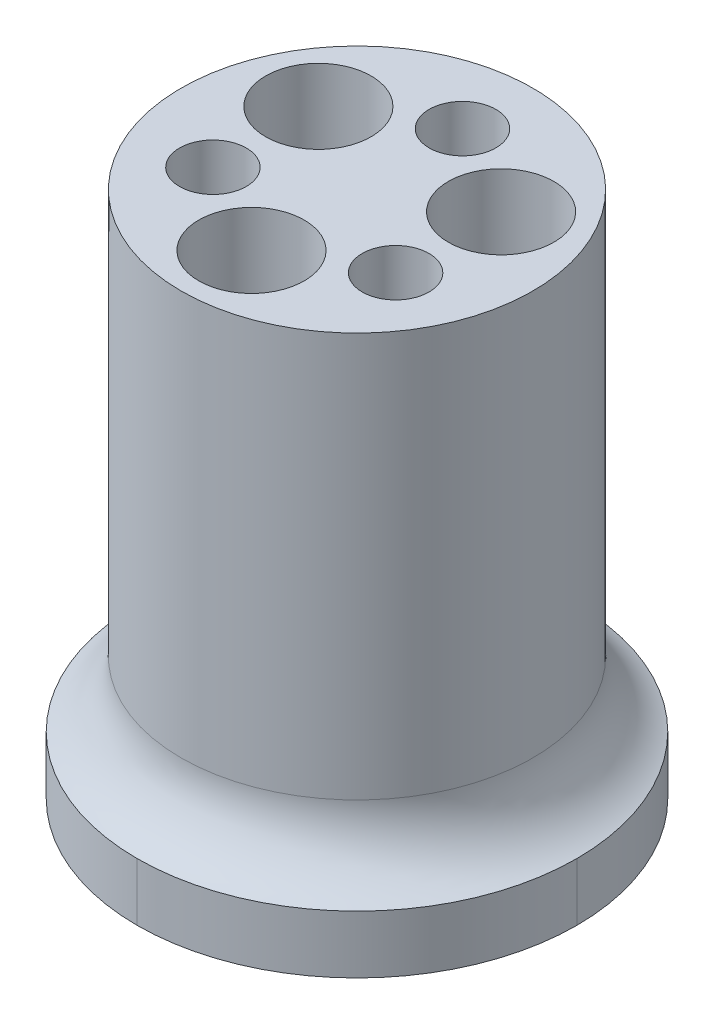
ISO-10303-21;
HEADER;
FILE_DESCRIPTION(('STEP AP214'),'2;1');
FILE_NAME('part.step','',(''),(''),'','','');
FILE_SCHEMA(('AUTOMOTIVE_DESIGN { 1 0 10303 214 1 1 1 1 }'));
ENDSEC;
DATA;
#1=APPLICATION_CONTEXT('core data for automotive mechanical design processes');
#2=APPLICATION_PROTOCOL_DEFINITION('international standard','automotive_design',2000,#1);
#3=PRODUCT_CONTEXT('',#1,'mechanical');
#4=PRODUCT('Part','Part','',(#3));
#5=PRODUCT_RELATED_PRODUCT_CATEGORY('part','',(#4));
#6=PRODUCT_DEFINITION_FORMATION('','',#4);
#7=PRODUCT_DEFINITION_CONTEXT('part definition',#1,'design');
#8=PRODUCT_DEFINITION('design','',#6,#7);
#9=PRODUCT_DEFINITION_SHAPE('','',#8);
#10=(LENGTH_UNIT() NAMED_UNIT(*) SI_UNIT(.MILLI.,.METRE.));
#11=(NAMED_UNIT(*) PLANE_ANGLE_UNIT() SI_UNIT($,.RADIAN.));
#12=(NAMED_UNIT(*) SI_UNIT($,.STERADIAN.) SOLID_ANGLE_UNIT());
#13=UNCERTAINTY_MEASURE_WITH_UNIT(LENGTH_MEASURE(1.E-05),#10,'distance_accuracy_value','');
#14=(GEOMETRIC_REPRESENTATION_CONTEXT(3) GLOBAL_UNCERTAINTY_ASSIGNED_CONTEXT((#13)) GLOBAL_UNIT_ASSIGNED_CONTEXT((#10,
#11,#12)) REPRESENTATION_CONTEXT('',''));
#15=CARTESIAN_POINT('',(0.,0.,0.));
#16=DIRECTION('',(0.,0.,1.));
#17=DIRECTION('',(1.,0.,0.));
#18=AXIS2_PLACEMENT_3D('',#15,#16,#17);
#19=CARTESIAN_POINT('',(0.,3.,0.));
#20=DIRECTION('',(0.,-1.,0.));
#21=DIRECTION('',(0.,0.,-1.));
#22=AXIS2_PLACEMENT_3D('',#19,#20,#21);
#23=CYLINDRICAL_SURFACE('',#22,12.5);
#24=DIRECTION('',(0.,-1.,0.));
#25=VECTOR('',#24,1.);
#26=CARTESIAN_POINT('',(0.,3.,-12.5));
#27=LINE('',#26,#25);
#28=CARTESIAN_POINT('',(0.,0.,-12.5));
#29=VERTEX_POINT('',#28);
#30=CARTESIAN_POINT('',(0.,3.29190075645217,-12.5));
#31=VERTEX_POINT('',#30);
#32=EDGE_CURVE('E122',#29,#31,#27,.F.);
#33=ORIENTED_EDGE('',*,*,#32,.T.);
#34=CARTESIAN_POINT('',(0.,3.29190075645216,0.));
#35=DIRECTION('',(0.,1.,0.));
#36=DIRECTION('',(0.,0.,1.));
#37=AXIS2_PLACEMENT_3D('',#34,#35,#36);
#38=CIRCLE('',#37,12.5);
#39=CARTESIAN_POINT('',(12.5,3.29190075645216,0.));
#40=VERTEX_POINT('',#39);
#41=EDGE_CURVE('E52',#40,#31,#38,.T.);
#42=ORIENTED_EDGE('',*,*,#41,.F.);
#43=DIRECTION('',(0.,-1.,0.));
#44=VECTOR('',#43,1.);
#45=CARTESIAN_POINT('',(12.5,3.,0.));
#46=LINE('',#45,#44);
#47=CARTESIAN_POINT('',(12.5,0.,0.));
#48=VERTEX_POINT('',#47);
#49=EDGE_CURVE('E93',#40,#48,#46,.T.);
#50=ORIENTED_EDGE('',*,*,#49,.T.);
#51=CARTESIAN_POINT('',(0.,0.,0.));
#52=DIRECTION('',(0.,1.,0.));
#53=DIRECTION('',(0.,0.,1.));
#54=AXIS2_PLACEMENT_3D('',#51,#52,#53);
#55=CIRCLE('',#54,12.5);
#56=EDGE_CURVE('E11',#29,#48,#55,.F.);
#57=ORIENTED_EDGE('',*,*,#56,.F.);
#58=EDGE_LOOP('',(#33,#42,#50,#57));
#59=FACE_BOUND('',#58,.T.);
#60=ADVANCED_FACE('F44',(#59),#23,.T.);
#61=CARTESIAN_POINT('',(0.,3.,0.));
#62=DIRECTION('',(0.,-1.,0.));
#63=DIRECTION('',(0.,0.,-1.));
#64=AXIS2_PLACEMENT_3D('',#61,#62,#63);
#65=CYLINDRICAL_SURFACE('',#64,12.5);
#66=DIRECTION('',(0.,-1.,0.));
#67=VECTOR('',#66,1.);
#68=CARTESIAN_POINT('',(-12.5,3.,0.));
#69=LINE('',#68,#67);
#70=CARTESIAN_POINT('',(-12.5,0.,0.));
#71=VERTEX_POINT('',#70);
#72=CARTESIAN_POINT('',(-12.5,3.29190075645217,0.));
#73=VERTEX_POINT('',#72);
#74=EDGE_CURVE('E97',#71,#73,#69,.F.);
#75=ORIENTED_EDGE('',*,*,#74,.T.);
#76=CARTESIAN_POINT('',(0.,3.29190075645217,0.));
#77=DIRECTION('',(0.,1.,0.));
#78=DIRECTION('',(0.,0.,1.));
#79=AXIS2_PLACEMENT_3D('',#76,#77,#78);
#80=CIRCLE('',#79,12.5);
#81=EDGE_CURVE('E125',#31,#73,#80,.T.);
#82=ORIENTED_EDGE('',*,*,#81,.F.);
#83=ORIENTED_EDGE('',*,*,#32,.F.);
#84=CARTESIAN_POINT('',(0.,0.,0.));
#85=DIRECTION('',(0.,1.,0.));
#86=DIRECTION('',(0.,0.,1.));
#87=AXIS2_PLACEMENT_3D('',#84,#85,#86);
#88=CIRCLE('',#87,12.5);
#89=EDGE_CURVE('E87',#71,#29,#88,.F.);
#90=ORIENTED_EDGE('',*,*,#89,.F.);
#91=EDGE_LOOP('',(#75,#82,#83,#90));
#92=FACE_BOUND('',#91,.T.);
#93=ADVANCED_FACE('F136',(#92),#65,.T.);
#94=CARTESIAN_POINT('',(0.,3.,0.));
#95=DIRECTION('',(0.,-1.,0.));
#96=DIRECTION('',(0.,0.,-1.));
#97=AXIS2_PLACEMENT_3D('',#94,#95,#96);
#98=CYLINDRICAL_SURFACE('',#97,12.5);
#99=DIRECTION('',(0.,-1.,0.));
#100=VECTOR('',#99,1.);
#101=CARTESIAN_POINT('',(0.,3.,12.5));
#102=LINE('',#101,#100);
#103=CARTESIAN_POINT('',(0.,0.,12.5));
#104=VERTEX_POINT('',#103);
#105=CARTESIAN_POINT('',(0.,3.29190075645217,12.5));
#106=VERTEX_POINT('',#105);
#107=EDGE_CURVE('E95',#104,#106,#102,.F.);
#108=ORIENTED_EDGE('',*,*,#107,.T.);
#109=CARTESIAN_POINT('',(0.,3.29190075645217,0.));
#110=DIRECTION('',(0.,1.,0.));
#111=DIRECTION('',(0.,0.,1.));
#112=AXIS2_PLACEMENT_3D('',#109,#110,#111);
#113=CIRCLE('',#112,12.5);
#114=EDGE_CURVE('E116',#73,#106,#113,.T.);
#115=ORIENTED_EDGE('',*,*,#114,.F.);
#116=ORIENTED_EDGE('',*,*,#74,.F.);
#117=CARTESIAN_POINT('',(0.,0.,0.));
#118=DIRECTION('',(0.,1.,0.));
#119=DIRECTION('',(0.,0.,1.));
#120=AXIS2_PLACEMENT_3D('',#117,#118,#119);
#121=CIRCLE('',#120,12.5);
#122=EDGE_CURVE('E119',#104,#71,#121,.F.);
#123=ORIENTED_EDGE('',*,*,#122,.F.);
#124=EDGE_LOOP('',(#108,#115,#116,#123));
#125=FACE_BOUND('',#124,.T.);
#126=ADVANCED_FACE('F135',(#125),#98,.T.);
#127=CARTESIAN_POINT('',(0.,3.,0.));
#128=DIRECTION('',(0.,-1.,0.));
#129=DIRECTION('',(0.,0.,-1.));
#130=AXIS2_PLACEMENT_3D('',#127,#128,#129);
#131=CYLINDRICAL_SURFACE('',#130,12.5);
#132=ORIENTED_EDGE('',*,*,#49,.F.);
#133=CARTESIAN_POINT('',(0.,3.29190075645217,0.));
#134=DIRECTION('',(0.,1.,0.));
#135=DIRECTION('',(0.,0.,1.));
#136=AXIS2_PLACEMENT_3D('',#133,#134,#135);
#137=CIRCLE('',#136,12.5);
#138=EDGE_CURVE('E98',#106,#40,#137,.T.);
#139=ORIENTED_EDGE('',*,*,#138,.F.);
#140=ORIENTED_EDGE('',*,*,#107,.F.);
#141=CARTESIAN_POINT('',(0.,0.,0.));
#142=DIRECTION('',(0.,1.,0.));
#143=DIRECTION('',(0.,0.,1.));
#144=AXIS2_PLACEMENT_3D('',#141,#142,#143);
#145=CIRCLE('',#144,12.5);
#146=EDGE_CURVE('E85',#48,#104,#145,.F.);
#147=ORIENTED_EDGE('',*,*,#146,.F.);
#148=EDGE_LOOP('',(#132,#139,#140,#147));
#149=FACE_BOUND('',#148,.T.);
#150=ADVANCED_FACE('F91',(#149),#131,.T.);
#151=CARTESIAN_POINT('',(0.,7.,0.));
#152=DIRECTION('',(0.,1.,0.));
#153=DIRECTION('',(0.,0.,1.));
#154=AXIS2_PLACEMENT_3D('',#151,#152,#153);
#155=TOROIDAL_SURFACE('',#154,14.,4.);
#156=CARTESIAN_POINT('',(0.,7.,0.));
#157=DIRECTION('',(0.,1.,0.));
#158=DIRECTION('',(0.,0.,1.));
#159=AXIS2_PLACEMENT_3D('',#156,#157,#158);
#160=CIRCLE('',#159,10.);
#161=CARTESIAN_POINT('',(0.,7.,10.));
#162=VERTEX_POINT('',#161);
#163=EDGE_CURVE('E101',#162,#162,#160,.T.);
#164=ORIENTED_EDGE('',*,*,#163,.F.);
#165=EDGE_LOOP('',(#164));
#166=FACE_BOUND('',#165,.T.);
#167=ORIENTED_EDGE('',*,*,#138,.T.);
#168=ORIENTED_EDGE('',*,*,#41,.T.);
#169=ORIENTED_EDGE('',*,*,#81,.T.);
#170=ORIENTED_EDGE('',*,*,#114,.T.);
#171=EDGE_LOOP('',(#167,#168,#169,#170));
#172=FACE_BOUND('',#171,.T.);
#173=ADVANCED_FACE('F131',(#166,#172),#155,.F.);
#174=CARTESIAN_POINT('',(0.,30.,0.));
#175=DIRECTION('',(0.,-1.,0.));
#176=DIRECTION('',(0.,0.,-1.));
#177=AXIS2_PLACEMENT_3D('',#174,#175,#176);
#178=CYLINDRICAL_SURFACE('',#177,10.);
#179=ORIENTED_EDGE('',*,*,#163,.T.);
#180=EDGE_LOOP('',(#179));
#181=FACE_BOUND('',#180,.T.);
#182=CARTESIAN_POINT('',(0.,30.,0.));
#183=DIRECTION('',(0.,1.,0.));
#184=DIRECTION('',(0.,0.,1.));
#185=AXIS2_PLACEMENT_3D('',#182,#183,#184);
#186=CIRCLE('',#185,10.);
#187=CARTESIAN_POINT('',(0.,30.,10.));
#188=VERTEX_POINT('',#187);
#189=EDGE_CURVE('E107',#188,#188,#186,.T.);
#190=ORIENTED_EDGE('',*,*,#189,.F.);
#191=EDGE_LOOP('',(#190));
#192=FACE_BOUND('',#191,.T.);
#193=ADVANCED_FACE('F148',(#181,#192),#178,.T.);
#194=CARTESIAN_POINT('',(0.,30.,0.));
#195=DIRECTION('',(0.,1.,0.));
#196=DIRECTION('',(0.,0.,1.));
#197=AXIS2_PLACEMENT_3D('',#194,#195,#196);
#198=PLANE('',#197);
#199=CARTESIAN_POINT('',(0.,30.,6.));
#200=DIRECTION('',(0.,1.,0.));
#201=DIRECTION('',(0.,0.,1.));
#202=AXIS2_PLACEMENT_3D('',#199,#200,#201);
#203=CIRCLE('',#202,3.);
#204=CARTESIAN_POINT('',(0.,30.,9.));
#205=VERTEX_POINT('',#204);
#206=EDGE_CURVE('E237',#205,#205,#203,.T.);
#207=ORIENTED_EDGE('',*,*,#206,.F.);
#208=EDGE_LOOP('',(#207));
#209=FACE_BOUND('',#208,.T.);
#210=CARTESIAN_POINT('',(5.19615242270664,30.,-2.99999999999999));
#211=DIRECTION('',(0.,1.,0.));
#212=DIRECTION('',(0.,0.,1.));
#213=AXIS2_PLACEMENT_3D('',#210,#211,#212);
#214=CIRCLE('',#213,3.);
#215=CARTESIAN_POINT('',(5.19615242270664,30.,0.));
#216=VERTEX_POINT('',#215);
#217=EDGE_CURVE('E227',#216,#216,#214,.T.);
#218=ORIENTED_EDGE('',*,*,#217,.F.);
#219=EDGE_LOOP('',(#218));
#220=FACE_BOUND('',#219,.T.);
#221=CARTESIAN_POINT('',(-5.1961524227066,30.,-3.00000000000006));
#222=DIRECTION('',(0.,1.,0.));
#223=DIRECTION('',(0.,0.,1.));
#224=AXIS2_PLACEMENT_3D('',#221,#222,#223);
#225=CIRCLE('',#224,3.);
#226=CARTESIAN_POINT('',(-5.1961524227066,30.,0.));
#227=VERTEX_POINT('',#226);
#228=EDGE_CURVE('E230',#227,#227,#225,.T.);
#229=ORIENTED_EDGE('',*,*,#228,.F.);
#230=EDGE_LOOP('',(#229));
#231=FACE_BOUND('',#230,.T.);
#232=CARTESIAN_POINT('',(0.,30.,-6.));
#233=DIRECTION('',(0.,1.,0.));
#234=DIRECTION('',(0.,0.,1.));
#235=AXIS2_PLACEMENT_3D('',#232,#233,#234);
#236=CIRCLE('',#235,1.9);
#237=CARTESIAN_POINT('',(0.,30.,-4.1));
#238=VERTEX_POINT('',#237);
#239=EDGE_CURVE('E256',#238,#238,#236,.T.);
#240=ORIENTED_EDGE('',*,*,#239,.F.);
#241=EDGE_LOOP('',(#240));
#242=FACE_BOUND('',#241,.T.);
#243=CARTESIAN_POINT('',(-5.19615242270666,30.,2.99999999999995));
#244=DIRECTION('',(0.,1.,0.));
#245=DIRECTION('',(0.,0.,1.));
#246=AXIS2_PLACEMENT_3D('',#243,#244,#245);
#247=CIRCLE('',#246,1.9);
#248=CARTESIAN_POINT('',(-5.19615242270666,30.,4.89999999999995));
#249=VERTEX_POINT('',#248);
#250=EDGE_CURVE('E260',#249,#249,#247,.T.);
#251=ORIENTED_EDGE('',*,*,#250,.F.);
#252=EDGE_LOOP('',(#251));
#253=FACE_BOUND('',#252,.T.);
#254=CARTESIAN_POINT('',(5.19615242270662,30.,3.00000000000003));
#255=DIRECTION('',(0.,1.,0.));
#256=DIRECTION('',(0.,0.,1.));
#257=AXIS2_PLACEMENT_3D('',#254,#255,#256);
#258=CIRCLE('',#257,1.9);
#259=CARTESIAN_POINT('',(5.19615242270662,30.,4.90000000000003));
#260=VERTEX_POINT('',#259);
#261=EDGE_CURVE('E268',#260,#260,#258,.T.);
#262=ORIENTED_EDGE('',*,*,#261,.F.);
#263=EDGE_LOOP('',(#262));
#264=FACE_BOUND('',#263,.T.);
#265=ORIENTED_EDGE('',*,*,#189,.T.);
#266=EDGE_LOOP('',(#265));
#267=FACE_BOUND('',#266,.T.);
#268=ADVANCED_FACE('F152',(#209,#220,#231,#242,#253,#264,#267),#198,.T.);
#269=CARTESIAN_POINT('',(0.,0.,0.));
#270=DIRECTION('',(0.,1.,0.));
#271=DIRECTION('',(0.,0.,1.));
#272=AXIS2_PLACEMENT_3D('',#269,#270,#271);
#273=PLANE('',#272);
#274=CARTESIAN_POINT('',(0.,0.,6.));
#275=DIRECTION('',(0.,-1.,0.));
#276=DIRECTION('',(0.,0.,-1.));
#277=AXIS2_PLACEMENT_3D('',#274,#275,#276);
#278=CIRCLE('',#277,1.6);
#279=CARTESIAN_POINT('',(0.,0.,4.4));
#280=VERTEX_POINT('',#279);
#281=EDGE_CURVE('E279',#280,#280,#278,.T.);
#282=ORIENTED_EDGE('',*,*,#281,.F.);
#283=EDGE_LOOP('',(#282));
#284=FACE_BOUND('',#283,.T.);
#285=CARTESIAN_POINT('',(5.19615242270664,0.,-2.99999999999999));
#286=DIRECTION('',(0.,-1.,0.));
#287=DIRECTION('',(0.,0.,-1.));
#288=AXIS2_PLACEMENT_3D('',#285,#286,#287);
#289=CIRCLE('',#288,1.6);
#290=CARTESIAN_POINT('',(5.19615242270664,0.,-4.59999999999999));
#291=VERTEX_POINT('',#290);
#292=EDGE_CURVE('E291',#291,#291,#289,.T.);
#293=ORIENTED_EDGE('',*,*,#292,.F.);
#294=EDGE_LOOP('',(#293));
#295=FACE_BOUND('',#294,.T.);
#296=CARTESIAN_POINT('',(-5.1961524227066,0.,-3.00000000000006));
#297=DIRECTION('',(0.,-1.,0.));
#298=DIRECTION('',(0.,0.,-1.));
#299=AXIS2_PLACEMENT_3D('',#296,#297,#298);
#300=CIRCLE('',#299,1.6);
#301=CARTESIAN_POINT('',(-5.1961524227066,0.,-4.60000000000006));
#302=VERTEX_POINT('',#301);
#303=EDGE_CURVE('E283',#302,#302,#300,.T.);
#304=ORIENTED_EDGE('',*,*,#303,.F.);
#305=EDGE_LOOP('',(#304));
#306=FACE_BOUND('',#305,.T.);
#307=ORIENTED_EDGE('',*,*,#89,.T.);
#308=ORIENTED_EDGE('',*,*,#56,.T.);
#309=ORIENTED_EDGE('',*,*,#146,.T.);
#310=ORIENTED_EDGE('',*,*,#122,.T.);
#311=EDGE_LOOP('',(#307,#308,#309,#310));
#312=FACE_BOUND('',#311,.T.);
#313=ADVANCED_FACE('F83',(#284,#295,#306,#312),#273,.F.);
#314=CARTESIAN_POINT('',(0.,15.,6.));
#315=DIRECTION('',(0.,-1.,0.));
#316=DIRECTION('',(0.,0.,-1.));
#317=AXIS2_PLACEMENT_3D('',#314,#315,#316);
#318=PLANE('',#317);
#319=CARTESIAN_POINT('',(0.,15.,6.));
#320=DIRECTION('',(0.,-1.,0.));
#321=DIRECTION('',(0.,0.,-1.));
#322=AXIS2_PLACEMENT_3D('',#319,#320,#321);
#323=CIRCLE('',#322,1.6);
#324=CARTESIAN_POINT('',(0.,15.,4.4));
#325=VERTEX_POINT('',#324);
#326=EDGE_CURVE('E275',#325,#325,#323,.T.);
#327=ORIENTED_EDGE('',*,*,#326,.T.);
#328=EDGE_LOOP('',(#327));
#329=FACE_BOUND('',#328,.T.);
#330=CARTESIAN_POINT('',(0.,15.,6.));
#331=DIRECTION('',(0.,1.,0.));
#332=DIRECTION('',(0.,0.,1.));
#333=AXIS2_PLACEMENT_3D('',#330,#331,#332);
#334=CIRCLE('',#333,3.);
#335=CARTESIAN_POINT('',(0.,15.,9.));
#336=VERTEX_POINT('',#335);
#337=EDGE_CURVE('E243',#336,#336,#334,.T.);
#338=ORIENTED_EDGE('',*,*,#337,.T.);
#339=EDGE_LOOP('',(#338));
#340=FACE_BOUND('',#339,.T.);
#341=ADVANCED_FACE('F156',(#329,#340),#318,.F.);
#342=CARTESIAN_POINT('',(0.,15.,6.));
#343=DIRECTION('',(0.,-1.,0.));
#344=DIRECTION('',(0.,0.,-1.));
#345=AXIS2_PLACEMENT_3D('',#342,#343,#344);
#346=CYLINDRICAL_SURFACE('',#345,1.6);
#347=ORIENTED_EDGE('',*,*,#326,.F.);
#348=EDGE_LOOP('',(#347));
#349=FACE_BOUND('',#348,.T.);
#350=ORIENTED_EDGE('',*,*,#281,.T.);
#351=EDGE_LOOP('',(#350));
#352=FACE_BOUND('',#351,.T.);
#353=ADVANCED_FACE('F169',(#349,#352),#346,.F.);
#354=CARTESIAN_POINT('',(5.19615242270664,15.,-2.99999999999999));
#355=DIRECTION('',(0.,-1.,0.));
#356=DIRECTION('',(0.,0.,-1.));
#357=AXIS2_PLACEMENT_3D('',#354,#355,#356);
#358=PLANE('',#357);
#359=CARTESIAN_POINT('',(5.19615242270664,15.,-2.99999999999999));
#360=DIRECTION('',(0.,-1.,0.));
#361=DIRECTION('',(0.,0.,-1.));
#362=AXIS2_PLACEMENT_3D('',#359,#360,#361);
#363=CIRCLE('',#362,1.6);
#364=CARTESIAN_POINT('',(5.19615242270664,15.,-4.59999999999999));
#365=VERTEX_POINT('',#364);
#366=EDGE_CURVE('E255',#365,#365,#363,.T.);
#367=ORIENTED_EDGE('',*,*,#366,.T.);
#368=EDGE_LOOP('',(#367));
#369=FACE_BOUND('',#368,.T.);
#370=CARTESIAN_POINT('',(5.19615242270664,15.,-2.99999999999999));
#371=DIRECTION('',(0.,1.,0.));
#372=DIRECTION('',(0.,0.,1.));
#373=AXIS2_PLACEMENT_3D('',#370,#371,#372);
#374=CIRCLE('',#373,3.);
#375=CARTESIAN_POINT('',(5.19615242270664,15.,0.));
#376=VERTEX_POINT('',#375);
#377=EDGE_CURVE('E224',#376,#376,#374,.T.);
#378=ORIENTED_EDGE('',*,*,#377,.T.);
#379=EDGE_LOOP('',(#378));
#380=FACE_BOUND('',#379,.T.);
#381=ADVANCED_FACE('F165',(#369,#380),#358,.F.);
#382=CARTESIAN_POINT('',(5.19615242270664,15.,-2.99999999999999));
#383=DIRECTION('',(0.,-1.,0.));
#384=DIRECTION('',(0.,0.,-1.));
#385=AXIS2_PLACEMENT_3D('',#382,#383,#384);
#386=CYLINDRICAL_SURFACE('',#385,1.6);
#387=ORIENTED_EDGE('',*,*,#366,.F.);
#388=EDGE_LOOP('',(#387));
#389=FACE_BOUND('',#388,.T.);
#390=ORIENTED_EDGE('',*,*,#292,.T.);
#391=EDGE_LOOP('',(#390));
#392=FACE_BOUND('',#391,.T.);
#393=ADVANCED_FACE('F161',(#389,#392),#386,.F.);
#394=CARTESIAN_POINT('',(-5.1961524227066,15.,-3.00000000000006));
#395=DIRECTION('',(0.,-1.,0.));
#396=DIRECTION('',(0.,0.,-1.));
#397=AXIS2_PLACEMENT_3D('',#394,#395,#396);
#398=PLANE('',#397);
#399=CARTESIAN_POINT('',(-5.1961524227066,15.,-3.00000000000006));
#400=DIRECTION('',(0.,-1.,0.));
#401=DIRECTION('',(0.,0.,-1.));
#402=AXIS2_PLACEMENT_3D('',#399,#400,#401);
#403=CIRCLE('',#402,1.6);
#404=CARTESIAN_POINT('',(-5.1961524227066,15.,-4.60000000000006));
#405=VERTEX_POINT('',#404);
#406=EDGE_CURVE('E287',#405,#405,#403,.T.);
#407=ORIENTED_EDGE('',*,*,#406,.T.);
#408=EDGE_LOOP('',(#407));
#409=FACE_BOUND('',#408,.T.);
#410=CARTESIAN_POINT('',(-5.1961524227066,15.,-3.00000000000006));
#411=DIRECTION('',(0.,1.,0.));
#412=DIRECTION('',(0.,0.,1.));
#413=AXIS2_PLACEMENT_3D('',#410,#411,#412);
#414=CIRCLE('',#413,3.);
#415=CARTESIAN_POINT('',(-5.1961524227066,15.,0.));
#416=VERTEX_POINT('',#415);
#417=EDGE_CURVE('E235',#416,#416,#414,.T.);
#418=ORIENTED_EDGE('',*,*,#417,.T.);
#419=EDGE_LOOP('',(#418));
#420=FACE_BOUND('',#419,.T.);
#421=ADVANCED_FACE('F164',(#409,#420),#398,.F.);
#422=CARTESIAN_POINT('',(-5.1961524227066,15.,-3.00000000000006));
#423=DIRECTION('',(0.,-1.,0.));
#424=DIRECTION('',(0.,0.,-1.));
#425=AXIS2_PLACEMENT_3D('',#422,#423,#424);
#426=CYLINDRICAL_SURFACE('',#425,1.6);
#427=ORIENTED_EDGE('',*,*,#406,.F.);
#428=EDGE_LOOP('',(#427));
#429=FACE_BOUND('',#428,.T.);
#430=ORIENTED_EDGE('',*,*,#303,.T.);
#431=EDGE_LOOP('',(#430));
#432=FACE_BOUND('',#431,.T.);
#433=ADVANCED_FACE('F171',(#429,#432),#426,.F.);
#434=CARTESIAN_POINT('',(5.19615242270662,20.,3.00000000000003));
#435=DIRECTION('',(0.,1.,0.));
#436=DIRECTION('',(0.,0.,1.));
#437=AXIS2_PLACEMENT_3D('',#434,#435,#436);
#438=CYLINDRICAL_SURFACE('',#437,1.9);
#439=CARTESIAN_POINT('',(5.19615242270662,20.,3.00000000000003));
#440=DIRECTION('',(0.,1.,0.));
#441=DIRECTION('',(0.,0.,1.));
#442=AXIS2_PLACEMENT_3D('',#439,#440,#441);
#443=CIRCLE('',#442,1.9);
#444=CARTESIAN_POINT('',(5.19615242270662,20.,4.90000000000003));
#445=VERTEX_POINT('',#444);
#446=EDGE_CURVE('E249',#445,#445,#443,.T.);
#447=ORIENTED_EDGE('',*,*,#446,.F.);
#448=EDGE_LOOP('',(#447));
#449=FACE_BOUND('',#448,.T.);
#450=ORIENTED_EDGE('',*,*,#261,.T.);
#451=EDGE_LOOP('',(#450));
#452=FACE_BOUND('',#451,.T.);
#453=ADVANCED_FACE('F174',(#449,#452),#438,.F.);
#454=CARTESIAN_POINT('',(5.19615242270662,20.,3.00000000000003));
#455=DIRECTION('',(0.,1.,0.));
#456=DIRECTION('',(0.,0.,1.));
#457=AXIS2_PLACEMENT_3D('',#454,#455,#456);
#458=PLANE('',#457);
#459=ORIENTED_EDGE('',*,*,#446,.T.);
#460=EDGE_LOOP('',(#459));
#461=FACE_BOUND('',#460,.T.);
#462=ADVANCED_FACE('F185',(#461),#458,.T.);
#463=CARTESIAN_POINT('',(-5.19615242270666,20.,2.99999999999995));
#464=DIRECTION('',(0.,1.,0.));
#465=DIRECTION('',(0.,0.,1.));
#466=AXIS2_PLACEMENT_3D('',#463,#464,#465);
#467=CYLINDRICAL_SURFACE('',#466,1.9);
#468=CARTESIAN_POINT('',(-5.19615242270666,20.,2.99999999999995));
#469=DIRECTION('',(0.,1.,0.));
#470=DIRECTION('',(0.,0.,1.));
#471=AXIS2_PLACEMENT_3D('',#468,#469,#470);
#472=CIRCLE('',#471,1.9);
#473=CARTESIAN_POINT('',(-5.19615242270666,20.,4.89999999999995));
#474=VERTEX_POINT('',#473);
#475=EDGE_CURVE('E264',#474,#474,#472,.T.);
#476=ORIENTED_EDGE('',*,*,#475,.F.);
#477=EDGE_LOOP('',(#476));
#478=FACE_BOUND('',#477,.T.);
#479=ORIENTED_EDGE('',*,*,#250,.T.);
#480=EDGE_LOOP('',(#479));
#481=FACE_BOUND('',#480,.T.);
#482=ADVANCED_FACE('F188',(#478,#481),#467,.F.);
#483=CARTESIAN_POINT('',(-5.19615242270666,20.,2.99999999999995));
#484=DIRECTION('',(0.,1.,0.));
#485=DIRECTION('',(0.,0.,1.));
#486=AXIS2_PLACEMENT_3D('',#483,#484,#485);
#487=PLANE('',#486);
#488=ORIENTED_EDGE('',*,*,#475,.T.);
#489=EDGE_LOOP('',(#488));
#490=FACE_BOUND('',#489,.T.);
#491=ADVANCED_FACE('F193',(#490),#487,.T.);
#492=CARTESIAN_POINT('',(0.,20.,-6.));
#493=DIRECTION('',(0.,1.,0.));
#494=DIRECTION('',(0.,0.,1.));
#495=AXIS2_PLACEMENT_3D('',#492,#493,#494);
#496=CYLINDRICAL_SURFACE('',#495,1.9);
#497=CARTESIAN_POINT('',(0.,20.,-6.));
#498=DIRECTION('',(0.,1.,0.));
#499=DIRECTION('',(0.,0.,1.));
#500=AXIS2_PLACEMENT_3D('',#497,#498,#499);
#501=CIRCLE('',#500,1.9);
#502=CARTESIAN_POINT('',(0.,20.,-4.1));
#503=VERTEX_POINT('',#502);
#504=EDGE_CURVE('E251',#503,#503,#501,.T.);
#505=ORIENTED_EDGE('',*,*,#504,.F.);
#506=EDGE_LOOP('',(#505));
#507=FACE_BOUND('',#506,.T.);
#508=ORIENTED_EDGE('',*,*,#239,.T.);
#509=EDGE_LOOP('',(#508));
#510=FACE_BOUND('',#509,.T.);
#511=ADVANCED_FACE('F196',(#507,#510),#496,.F.);
#512=CARTESIAN_POINT('',(0.,20.,-6.));
#513=DIRECTION('',(0.,1.,0.));
#514=DIRECTION('',(0.,0.,1.));
#515=AXIS2_PLACEMENT_3D('',#512,#513,#514);
#516=PLANE('',#515);
#517=ORIENTED_EDGE('',*,*,#504,.T.);
#518=EDGE_LOOP('',(#517));
#519=FACE_BOUND('',#518,.T.);
#520=ADVANCED_FACE('F203',(#519),#516,.T.);
#521=CARTESIAN_POINT('',(-5.1961524227066,15.,-3.00000000000006));
#522=DIRECTION('',(0.,1.,0.));
#523=DIRECTION('',(0.,0.,1.));
#524=AXIS2_PLACEMENT_3D('',#521,#522,#523);
#525=CYLINDRICAL_SURFACE('',#524,3.);
#526=ORIENTED_EDGE('',*,*,#417,.F.);
#527=EDGE_LOOP('',(#526));
#528=FACE_BOUND('',#527,.T.);
#529=ORIENTED_EDGE('',*,*,#228,.T.);
#530=EDGE_LOOP('',(#529));
#531=FACE_BOUND('',#530,.T.);
#532=ADVANCED_FACE('F207',(#528,#531),#525,.F.);
#533=CARTESIAN_POINT('',(5.19615242270664,15.,-2.99999999999999));
#534=DIRECTION('',(0.,1.,0.));
#535=DIRECTION('',(0.,0.,1.));
#536=AXIS2_PLACEMENT_3D('',#533,#534,#535);
#537=CYLINDRICAL_SURFACE('',#536,3.);
#538=ORIENTED_EDGE('',*,*,#377,.F.);
#539=EDGE_LOOP('',(#538));
#540=FACE_BOUND('',#539,.T.);
#541=ORIENTED_EDGE('',*,*,#217,.T.);
#542=EDGE_LOOP('',(#541));
#543=FACE_BOUND('',#542,.T.);
#544=ADVANCED_FACE('F211',(#540,#543),#537,.F.);
#545=CARTESIAN_POINT('',(0.,15.,6.));
#546=DIRECTION('',(0.,1.,0.));
#547=DIRECTION('',(0.,0.,1.));
#548=AXIS2_PLACEMENT_3D('',#545,#546,#547);
#549=CYLINDRICAL_SURFACE('',#548,3.);
#550=ORIENTED_EDGE('',*,*,#337,.F.);
#551=EDGE_LOOP('',(#550));
#552=FACE_BOUND('',#551,.T.);
#553=ORIENTED_EDGE('',*,*,#206,.T.);
#554=EDGE_LOOP('',(#553));
#555=FACE_BOUND('',#554,.T.);
#556=ADVANCED_FACE('F213',(#552,#555),#549,.F.);
#557=CLOSED_SHELL('',(#60,#93,#126,#150,#173,#193,#268,#313,#341,#353,#381,#393,#421,#433,#453,
#462,#482,#491,#511,#520,#532,#544,#556));
#558=MANIFOLD_SOLID_BREP('B2',#557);
#559=ADVANCED_BREP_SHAPE_REPRESENTATION('',(#18,#558),#14);
#560=SHAPE_DEFINITION_REPRESENTATION(#9,#559);
ENDSEC;
END-ISO-10303-21;
